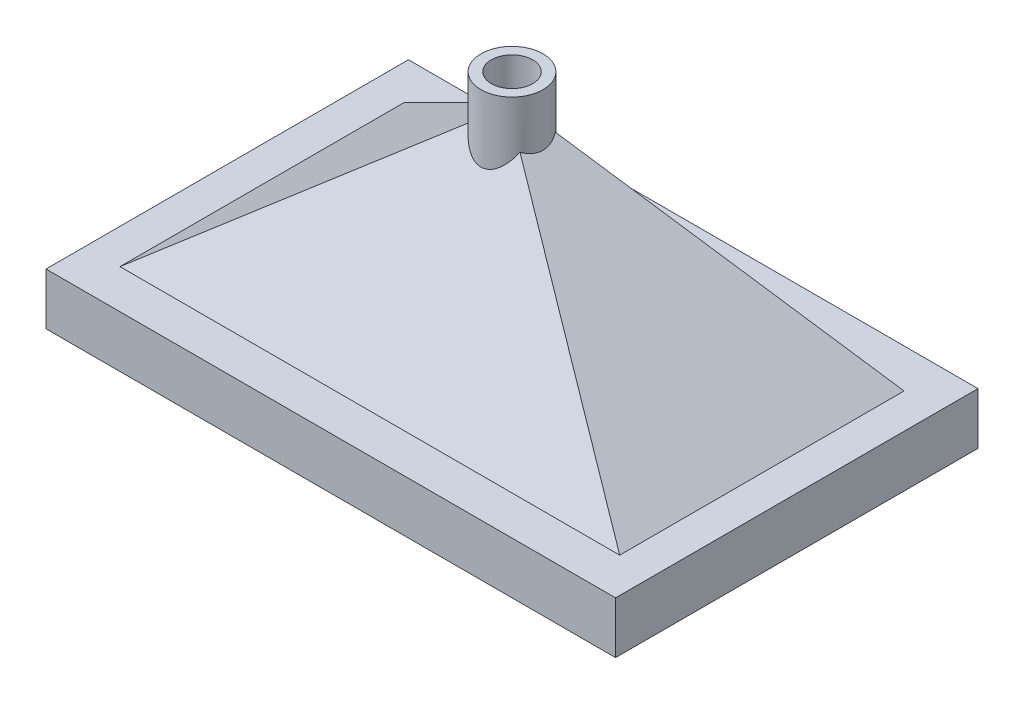
ISO-10303-21;
HEADER;
FILE_DESCRIPTION(('STEP AP214'),'2;1');
FILE_NAME('part.step','',(''),(''),'','','');
FILE_SCHEMA(('AUTOMOTIVE_DESIGN { 1 0 10303 214 1 1 1 1 }'));
ENDSEC;
DATA;
#1=APPLICATION_CONTEXT('core data for automotive mechanical design processes');
#2=APPLICATION_PROTOCOL_DEFINITION('international standard','automotive_design',2000,#1);
#3=PRODUCT_CONTEXT('',#1,'mechanical');
#4=PRODUCT('Part','Part','',(#3));
#5=PRODUCT_RELATED_PRODUCT_CATEGORY('part','',(#4));
#6=PRODUCT_DEFINITION_FORMATION('','',#4);
#7=PRODUCT_DEFINITION_CONTEXT('part definition',#1,'design');
#8=PRODUCT_DEFINITION('design','',#6,#7);
#9=PRODUCT_DEFINITION_SHAPE('','',#8);
#10=(LENGTH_UNIT() NAMED_UNIT(*) SI_UNIT(.MILLI.,.METRE.));
#11=(NAMED_UNIT(*) PLANE_ANGLE_UNIT() SI_UNIT($,.RADIAN.));
#12=(NAMED_UNIT(*) SI_UNIT($,.STERADIAN.) SOLID_ANGLE_UNIT());
#13=UNCERTAINTY_MEASURE_WITH_UNIT(LENGTH_MEASURE(1.E-05),#10,'distance_accuracy_value','');
#14=(GEOMETRIC_REPRESENTATION_CONTEXT(3) GLOBAL_UNCERTAINTY_ASSIGNED_CONTEXT((#13)) GLOBAL_UNIT_ASSIGNED_CONTEXT((#10,
#11,#12)) REPRESENTATION_CONTEXT('',''));
#15=CARTESIAN_POINT('',(0.,0.,0.));
#16=DIRECTION('',(0.,0.,1.));
#17=DIRECTION('',(1.,0.,0.));
#18=AXIS2_PLACEMENT_3D('',#15,#16,#17);
#19=CARTESIAN_POINT('',(-1.22788122702984,1.57870443475265,-25.));
#20=DIRECTION('',(-0.613940613514921,0.789352217376326,0.));
#21=DIRECTION('',(-0.789352217376326,-0.613940613514921,0.));
#22=AXIS2_PLACEMENT_3D('',#19,#20,#21);
#23=PLANE('',#22);
#24=CARTESIAN_POINT('',(0.,2.53372316688697,0.));
#25=DIRECTION('',(-0.613940613514921,0.789352217376326,0.));
#26=DIRECTION('',(0.789352217376326,0.613940613514921,0.));
#27=AXIS2_PLACEMENT_3D('',#24,#25,#26);
#28=ELLIPSE('',#27,7.60116950066092,6.);
#29=CARTESIAN_POINT('',(-4.94642029621275,-1.31349261905628,-3.39601623276666));
#30=VERTEX_POINT('',#29);
#31=CARTESIAN_POINT('',(-4.94642029621274,-1.31349261905627,3.39601623276666));
#32=VERTEX_POINT('',#31);
#33=EDGE_CURVE('E295',#30,#32,#28,.T.);
#34=ORIENTED_EDGE('',*,*,#33,.F.);
#35=DIRECTION('',(-0.722897396012249,-0.562253530231749,-0.40160966445125));
#36=VECTOR('',#35,1.);
#37=CARTESIAN_POINT('',(-8.09976991254644,-3.76609787620471,-5.14787713072983));
#38=LINE('',#37,#36);
#39=CARTESIAN_POINT('',(-48.2576440717118,-35.,-27.457807219155));
#40=VERTEX_POINT('',#39);
#41=EDGE_CURVE('E323',#30,#40,#38,.T.);
#42=ORIENTED_EDGE('',*,*,#41,.T.);
#43=DIRECTION('',(0.,0.,1.));
#44=VECTOR('',#43,1.);
#45=CARTESIAN_POINT('',(-48.2576440717118,-35.,0.));
#46=LINE('',#45,#44);
#47=CARTESIAN_POINT('',(-48.2576440717118,-35.,27.457807219155));
#48=VERTEX_POINT('',#47);
#49=EDGE_CURVE('E322',#40,#48,#46,.T.);
#50=ORIENTED_EDGE('',*,*,#49,.T.);
#51=DIRECTION('',(-0.722897396012249,-0.562253530231749,0.40160966445125));
#52=VECTOR('',#51,1.);
#53=CARTESIAN_POINT('',(6.41635911971163,7.52422470444046,-2.91663899830243));
#54=LINE('',#53,#52);
#55=EDGE_CURVE('E320',#32,#48,#54,.T.);
#56=ORIENTED_EDGE('',*,*,#55,.F.);
#57=EDGE_LOOP('',(#34,#42,#50,#56));
#58=FACE_BOUND('',#57,.T.);
#59=ADVANCED_FACE('F68',(#58),#23,.T.);
#60=CARTESIAN_POINT('',(1.22788122702984,1.57870443475265,-25.));
#61=DIRECTION('',(0.613940613514921,0.789352217376326,0.));
#62=DIRECTION('',(-0.789352217376326,0.613940613514921,0.));
#63=AXIS2_PLACEMENT_3D('',#60,#61,#62);
#64=PLANE('',#63);
#65=CARTESIAN_POINT('',(0.,2.53372316688697,0.));
#66=DIRECTION('',(0.613940613514921,0.789352217376326,0.));
#67=DIRECTION('',(-0.789352217376326,0.613940613514921,0.));
#68=AXIS2_PLACEMENT_3D('',#65,#66,#67);
#69=ELLIPSE('',#68,7.60116950066092,6.);
#70=CARTESIAN_POINT('',(4.94642029621274,-1.31349261905627,3.39601623276666));
#71=VERTEX_POINT('',#70);
#72=CARTESIAN_POINT('',(4.94642029621275,-1.31349261905628,-3.39601623276666));
#73=VERTEX_POINT('',#72);
#74=EDGE_CURVE('E84',#71,#73,#69,.T.);
#75=ORIENTED_EDGE('',*,*,#74,.F.);
#76=DIRECTION('',(-0.722897396012249,0.562253530231749,-0.40160966445125));
#77=VECTOR('',#76,1.);
#78=CARTESIAN_POINT('',(-6.41635911971163,7.52422470444046,-2.91663899830243));
#79=LINE('',#78,#77);
#80=CARTESIAN_POINT('',(48.2576440717118,-35.,27.457807219155));
#81=VERTEX_POINT('',#80);
#82=EDGE_CURVE('E327',#81,#71,#79,.T.);
#83=ORIENTED_EDGE('',*,*,#82,.F.);
#84=DIRECTION('',(0.,0.,-1.));
#85=VECTOR('',#84,1.);
#86=CARTESIAN_POINT('',(48.2576440717118,-35.,0.));
#87=LINE('',#86,#85);
#88=CARTESIAN_POINT('',(48.2576440717118,-35.,-27.4578072191551));
#89=VERTEX_POINT('',#88);
#90=EDGE_CURVE('E336',#81,#89,#87,.T.);
#91=ORIENTED_EDGE('',*,*,#90,.T.);
#92=DIRECTION('',(-0.722897396012249,0.562253530231749,0.40160966445125));
#93=VECTOR('',#92,1.);
#94=CARTESIAN_POINT('',(8.09976991254644,-3.76609787620471,-5.14787713072983));
#95=LINE('',#94,#93);
#96=EDGE_CURVE('E319',#89,#73,#95,.T.);
#97=ORIENTED_EDGE('',*,*,#96,.T.);
#98=EDGE_LOOP('',(#75,#83,#91,#97));
#99=FACE_BOUND('',#98,.T.);
#100=ADVANCED_FACE('F396',(#99),#64,.T.);
#101=CARTESIAN_POINT('',(-45.,1.16247638743819,1.62746694241347));
#102=DIRECTION('',(0.,-0.581238193719096,-0.813733471206735));
#103=DIRECTION('',(0.,0.813733471206735,-0.581238193719096));
#104=AXIS2_PLACEMENT_3D('',#101,#102,#103);
#105=PLANE('',#104);
#106=ORIENTED_EDGE('',*,*,#82,.T.);
#107=CARTESIAN_POINT('',(0.,3.44093010681705,0.));
#108=DIRECTION('',(0.,-0.581238193719096,-0.813733471206735));
#109=DIRECTION('',(0.,0.813733471206735,-0.581238193719096));
#110=AXIS2_PLACEMENT_3D('',#107,#108,#109);
#111=ELLIPSE('',#110,10.3227903204512,6.);
#112=EDGE_CURVE('E91',#71,#32,#111,.T.);
#113=ORIENTED_EDGE('',*,*,#112,.T.);
#114=ORIENTED_EDGE('',*,*,#55,.T.);
#115=DIRECTION('',(1.,0.,0.));
#116=VECTOR('',#115,1.);
#117=CARTESIAN_POINT('',(-45.,-35.,27.457807219155));
#118=LINE('',#117,#116);
#119=EDGE_CURVE('E333',#48,#81,#118,.T.);
#120=ORIENTED_EDGE('',*,*,#119,.T.);
#121=EDGE_LOOP('',(#106,#113,#114,#120));
#122=FACE_BOUND('',#121,.T.);
#123=ADVANCED_FACE('F402',(#122),#105,.F.);
#124=CARTESIAN_POINT('',(-45.,1.16247638743819,-1.62746694241347));
#125=DIRECTION('',(0.,0.581238193719096,-0.813733471206735));
#126=DIRECTION('',(0.,0.813733471206735,0.581238193719096));
#127=AXIS2_PLACEMENT_3D('',#124,#125,#126);
#128=PLANE('',#127);
#129=CARTESIAN_POINT('',(0.,3.44093010681705,0.));
#130=DIRECTION('',(0.,0.581238193719096,-0.813733471206735));
#131=DIRECTION('',(0.,0.813733471206735,0.581238193719096));
#132=AXIS2_PLACEMENT_3D('',#129,#130,#131);
#133=ELLIPSE('',#132,10.3227903204512,6.);
#134=EDGE_CURVE('E291',#73,#30,#133,.T.);
#135=ORIENTED_EDGE('',*,*,#134,.F.);
#136=ORIENTED_EDGE('',*,*,#96,.F.);
#137=DIRECTION('',(-1.,0.,0.));
#138=VECTOR('',#137,1.);
#139=CARTESIAN_POINT('',(0.,-35.,-27.457807219155));
#140=LINE('',#139,#138);
#141=EDGE_CURVE('E330',#89,#40,#140,.T.);
#142=ORIENTED_EDGE('',*,*,#141,.T.);
#143=ORIENTED_EDGE('',*,*,#41,.F.);
#144=EDGE_LOOP('',(#135,#136,#142,#143));
#145=FACE_BOUND('',#144,.T.);
#146=ADVANCED_FACE('F70',(#145),#128,.T.);
#147=CARTESIAN_POINT('',(0.,0.,-25.));
#148=DIRECTION('',(-0.613940613514921,0.789352217376326,0.));
#149=DIRECTION('',(-0.789352217376326,-0.613940613514921,0.));
#150=AXIS2_PLACEMENT_3D('',#147,#148,#149);
#151=PLANE('',#150);
#152=DIRECTION('',(-0.722897396012249,-0.562253530231749,-0.40160966445125));
#153=VECTOR('',#152,1.);
#154=CARTESIAN_POINT('',(-7.25806451612903,-5.64516129032258,-4.03225806451614));
#155=LINE('',#154,#153);
#156=CARTESIAN_POINT('',(-5.24494365672923,-4.07940062190051,-2.9138575870718));
#157=VERTEX_POINT('',#156);
#158=CARTESIAN_POINT('',(-45.,-35.,-25.));
#159=VERTEX_POINT('',#158);
#160=EDGE_CURVE('E302',#157,#159,#155,.T.);
#161=ORIENTED_EDGE('',*,*,#160,.F.);
#162=CARTESIAN_POINT('',(0.,0.,0.));
#163=DIRECTION('',(-0.613940613514921,0.789352217376326,0.));
#164=DIRECTION('',(0.789352217376326,0.613940613514921,0.));
#165=AXIS2_PLACEMENT_3D('',#162,#163,#164);
#166=ELLIPSE('',#165,7.60116950066092,6.);
#167=CARTESIAN_POINT('',(-5.24494365672923,-4.07940062190051,2.91385758707179));
#168=VERTEX_POINT('',#167);
#169=EDGE_CURVE('E283',#157,#168,#166,.T.);
#170=ORIENTED_EDGE('',*,*,#169,.T.);
#171=DIRECTION('',(-0.722897396012249,-0.562253530231749,0.40160966445125));
#172=VECTOR('',#171,1.);
#173=CARTESIAN_POINT('',(7.25806451612904,5.64516129032259,-4.03225806451613));
#174=LINE('',#173,#172);
#175=CARTESIAN_POINT('',(-45.,-35.,25.));
#176=VERTEX_POINT('',#175);
#177=EDGE_CURVE('E305',#168,#176,#174,.T.);
#178=ORIENTED_EDGE('',*,*,#177,.T.);
#179=DIRECTION('',(0.,0.,1.));
#180=VECTOR('',#179,1.);
#181=CARTESIAN_POINT('',(-45.,-35.,25.));
#182=LINE('',#181,#180);
#183=EDGE_CURVE('E307',#159,#176,#182,.T.);
#184=ORIENTED_EDGE('',*,*,#183,.F.);
#185=EDGE_LOOP('',(#161,#170,#178,#184));
#186=FACE_BOUND('',#185,.T.);
#187=ADVANCED_FACE('F369',(#186),#151,.F.);
#188=CARTESIAN_POINT('',(0.,0.,-25.));
#189=DIRECTION('',(0.613940613514921,0.789352217376326,0.));
#190=DIRECTION('',(-0.789352217376326,0.613940613514921,0.));
#191=AXIS2_PLACEMENT_3D('',#188,#189,#190);
#192=PLANE('',#191);
#193=DIRECTION('',(-0.722897396012249,0.562253530231749,-0.40160966445125));
#194=VECTOR('',#193,1.);
#195=CARTESIAN_POINT('',(-7.25806451612904,5.64516129032259,-4.03225806451613));
#196=LINE('',#195,#194);
#197=CARTESIAN_POINT('',(45.,-35.,25.));
#198=VERTEX_POINT('',#197);
#199=CARTESIAN_POINT('',(5.24494365672923,-4.07940062190051,2.91385758707179));
#200=VERTEX_POINT('',#199);
#201=EDGE_CURVE('E316',#198,#200,#196,.T.);
#202=ORIENTED_EDGE('',*,*,#201,.T.);
#203=CARTESIAN_POINT('',(0.,0.,0.));
#204=DIRECTION('',(0.613940613514921,0.789352217376326,0.));
#205=DIRECTION('',(-0.789352217376326,0.613940613514921,0.));
#206=AXIS2_PLACEMENT_3D('',#203,#204,#205);
#207=ELLIPSE('',#206,7.60116950066092,6.);
#208=CARTESIAN_POINT('',(5.24494365672923,-4.07940062190051,-2.9138575870718));
#209=VERTEX_POINT('',#208);
#210=EDGE_CURVE('E288',#200,#209,#207,.T.);
#211=ORIENTED_EDGE('',*,*,#210,.T.);
#212=DIRECTION('',(-0.722897396012249,0.562253530231749,0.40160966445125));
#213=VECTOR('',#212,1.);
#214=CARTESIAN_POINT('',(7.25806451612903,-5.64516129032258,-4.03225806451614));
#215=LINE('',#214,#213);
#216=CARTESIAN_POINT('',(45.,-35.,-25.));
#217=VERTEX_POINT('',#216);
#218=EDGE_CURVE('E299',#217,#209,#215,.T.);
#219=ORIENTED_EDGE('',*,*,#218,.F.);
#220=DIRECTION('',(0.,0.,-1.));
#221=VECTOR('',#220,1.);
#222=CARTESIAN_POINT('',(45.,-35.,25.));
#223=LINE('',#222,#221);
#224=EDGE_CURVE('E312',#198,#217,#223,.T.);
#225=ORIENTED_EDGE('',*,*,#224,.F.);
#226=EDGE_LOOP('',(#202,#211,#219,#225));
#227=FACE_BOUND('',#226,.T.);
#228=ADVANCED_FACE('F377',(#227),#192,.F.);
#229=CARTESIAN_POINT('',(-45.,0.,0.));
#230=DIRECTION('',(0.,-0.581238193719096,-0.813733471206735));
#231=DIRECTION('',(0.,0.813733471206735,-0.581238193719096));
#232=AXIS2_PLACEMENT_3D('',#229,#230,#231);
#233=PLANE('',#232);
#234=CARTESIAN_POINT('',(0.,0.,0.));
#235=DIRECTION('',(0.,-0.581238193719096,-0.813733471206735));
#236=DIRECTION('',(0.,0.813733471206735,-0.581238193719096));
#237=AXIS2_PLACEMENT_3D('',#234,#235,#236);
#238=ELLIPSE('',#237,6.88186021363411,4.);
#239=CARTESIAN_POINT('',(1.80136003041694,-5.,3.57142857142857));
#240=VERTEX_POINT('',#239);
#241=CARTESIAN_POINT('',(-1.80136003041694,-5.,3.57142857142857));
#242=VERTEX_POINT('',#241);
#243=EDGE_CURVE('E264',#240,#242,#238,.T.);
#244=ORIENTED_EDGE('',*,*,#243,.F.);
#245=DIRECTION('',(1.,0.,0.));
#246=VECTOR('',#245,1.);
#247=CARTESIAN_POINT('',(-45.,-5.,3.57142857142857));
#248=LINE('',#247,#246);
#249=CARTESIAN_POINT('',(4.82129629448178,-5.,3.57142857142857));
#250=VERTEX_POINT('',#249);
#251=EDGE_CURVE('E280',#240,#250,#248,.T.);
#252=ORIENTED_EDGE('',*,*,#251,.T.);
#253=CARTESIAN_POINT('',(0.,0.,0.));
#254=DIRECTION('',(0.,-0.581238193719096,-0.813733471206735));
#255=DIRECTION('',(0.,0.813733471206735,-0.581238193719096));
#256=AXIS2_PLACEMENT_3D('',#253,#254,#255);
#257=ELLIPSE('',#256,10.3227903204512,6.);
#258=EDGE_CURVE('E289',#200,#250,#257,.T.);
#259=ORIENTED_EDGE('',*,*,#258,.F.);
#260=ORIENTED_EDGE('',*,*,#201,.F.);
#261=DIRECTION('',(1.,0.,0.));
#262=VECTOR('',#261,1.);
#263=CARTESIAN_POINT('',(45.,-35.,25.));
#264=LINE('',#263,#262);
#265=EDGE_CURVE('E309',#176,#198,#264,.T.);
#266=ORIENTED_EDGE('',*,*,#265,.F.);
#267=ORIENTED_EDGE('',*,*,#177,.F.);
#268=CARTESIAN_POINT('',(-4.82129629448178,-5.,3.57142857142857));
#269=VERTEX_POINT('',#268);
#270=EDGE_CURVE('E285',#269,#168,#257,.T.);
#271=ORIENTED_EDGE('',*,*,#270,.F.);
#272=EDGE_CURVE('E282',#269,#242,#248,.T.);
#273=ORIENTED_EDGE('',*,*,#272,.T.);
#274=EDGE_LOOP('',(#244,#252,#259,#260,#266,#267,#271,#273));
#275=FACE_BOUND('',#274,.T.);
#276=ADVANCED_FACE('F361',(#275),#233,.T.);
#277=CARTESIAN_POINT('',(-45.,0.,0.));
#278=DIRECTION('',(0.,0.581238193719096,-0.813733471206735));
#279=DIRECTION('',(0.,0.813733471206735,0.581238193719096));
#280=AXIS2_PLACEMENT_3D('',#277,#278,#279);
#281=PLANE('',#280);
#282=DIRECTION('',(1.,0.,0.));
#283=VECTOR('',#282,1.);
#284=CARTESIAN_POINT('',(-45.,-5.,-3.57142857142857));
#285=LINE('',#284,#283);
#286=CARTESIAN_POINT('',(1.80136003041693,-5.,-3.57142857142857));
#287=VERTEX_POINT('',#286);
#288=CARTESIAN_POINT('',(4.82129629448178,-5.,-3.57142857142857));
#289=VERTEX_POINT('',#288);
#290=EDGE_CURVE('E329',#287,#289,#285,.T.);
#291=ORIENTED_EDGE('',*,*,#290,.F.);
#292=CARTESIAN_POINT('',(0.,0.,0.));
#293=DIRECTION('',(0.,0.581238193719096,-0.813733471206735));
#294=DIRECTION('',(0.,0.813733471206735,0.581238193719096));
#295=AXIS2_PLACEMENT_3D('',#292,#293,#294);
#296=ELLIPSE('',#295,6.88186021363411,4.);
#297=CARTESIAN_POINT('',(-1.80136003041694,-5.,-3.57142857142857));
#298=VERTEX_POINT('',#297);
#299=EDGE_CURVE('E262',#287,#298,#296,.T.);
#300=ORIENTED_EDGE('',*,*,#299,.T.);
#301=CARTESIAN_POINT('',(-4.82129629448178,-5.,-3.57142857142857));
#302=VERTEX_POINT('',#301);
#303=EDGE_CURVE('E77',#302,#298,#285,.T.);
#304=ORIENTED_EDGE('',*,*,#303,.F.);
#305=CARTESIAN_POINT('',(0.,0.,0.));
#306=DIRECTION('',(0.,0.581238193719096,-0.813733471206735));
#307=DIRECTION('',(0.,0.813733471206735,0.581238193719096));
#308=AXIS2_PLACEMENT_3D('',#305,#306,#307);
#309=ELLIPSE('',#308,10.3227903204512,6.);
#310=EDGE_CURVE('E12',#302,#157,#309,.T.);
#311=ORIENTED_EDGE('',*,*,#310,.T.);
#312=ORIENTED_EDGE('',*,*,#160,.T.);
#313=DIRECTION('',(-1.,0.,0.));
#314=VECTOR('',#313,1.);
#315=CARTESIAN_POINT('',(45.,-35.,-25.));
#316=LINE('',#315,#314);
#317=EDGE_CURVE('E215',#217,#159,#316,.T.);
#318=ORIENTED_EDGE('',*,*,#317,.F.);
#319=ORIENTED_EDGE('',*,*,#218,.T.);
#320=EDGE_CURVE('E72',#209,#289,#309,.T.);
#321=ORIENTED_EDGE('',*,*,#320,.T.);
#322=EDGE_LOOP('',(#291,#300,#304,#311,#312,#318,#319,#321));
#323=FACE_BOUND('',#322,.T.);
#324=ADVANCED_FACE('F367',(#323),#281,.F.);
#325=CARTESIAN_POINT('',(0.,-5.,0.));
#326=DIRECTION('',(0.,1.,0.));
#327=DIRECTION('',(0.,0.,1.));
#328=AXIS2_PLACEMENT_3D('',#325,#326,#327);
#329=PLANE('',#328);
#330=ORIENTED_EDGE('',*,*,#251,.F.);
#331=CARTESIAN_POINT('',(0.,-5.,0.));
#332=DIRECTION('',(0.,1.,0.));
#333=DIRECTION('',(0.,0.,1.));
#334=AXIS2_PLACEMENT_3D('',#331,#332,#333);
#335=CIRCLE('',#334,4.);
#336=EDGE_CURVE('E273',#240,#287,#335,.T.);
#337=ORIENTED_EDGE('',*,*,#336,.T.);
#338=ORIENTED_EDGE('',*,*,#290,.T.);
#339=CARTESIAN_POINT('',(0.,-5.,0.));
#340=DIRECTION('',(0.,1.,0.));
#341=DIRECTION('',(0.,0.,1.));
#342=AXIS2_PLACEMENT_3D('',#339,#340,#341);
#343=CIRCLE('',#342,6.);
#344=EDGE_CURVE('E277',#250,#289,#343,.T.);
#345=ORIENTED_EDGE('',*,*,#344,.F.);
#346=EDGE_LOOP('',(#330,#337,#338,#345));
#347=FACE_BOUND('',#346,.T.);
#348=ADVANCED_FACE('F383',(#347),#329,.F.);
#349=CARTESIAN_POINT('',(0.,-5.,0.));
#350=DIRECTION('',(0.,1.,0.));
#351=DIRECTION('',(0.,0.,1.));
#352=AXIS2_PLACEMENT_3D('',#349,#350,#351);
#353=CYLINDRICAL_SURFACE('',#352,6.);
#354=ORIENTED_EDGE('',*,*,#210,.F.);
#355=ORIENTED_EDGE('',*,*,#258,.T.);
#356=ORIENTED_EDGE('',*,*,#344,.T.);
#357=ORIENTED_EDGE('',*,*,#320,.F.);
#358=EDGE_LOOP('',(#354,#355,#356,#357));
#359=FACE_BOUND('',#358,.T.);
#360=ADVANCED_FACE('F381',(#359),#353,.T.);
#361=ORIENTED_EDGE('',*,*,#272,.F.);
#362=EDGE_CURVE('E276',#302,#269,#343,.T.);
#363=ORIENTED_EDGE('',*,*,#362,.F.);
#364=ORIENTED_EDGE('',*,*,#303,.T.);
#365=EDGE_CURVE('E272',#298,#242,#335,.T.);
#366=ORIENTED_EDGE('',*,*,#365,.T.);
#367=EDGE_LOOP('',(#361,#363,#364,#366));
#368=FACE_BOUND('',#367,.T.);
#369=ADVANCED_FACE('F350',(#368),#329,.F.);
#370=ORIENTED_EDGE('',*,*,#362,.T.);
#371=ORIENTED_EDGE('',*,*,#270,.T.);
#372=ORIENTED_EDGE('',*,*,#169,.F.);
#373=ORIENTED_EDGE('',*,*,#310,.F.);
#374=EDGE_LOOP('',(#370,#371,#372,#373));
#375=FACE_BOUND('',#374,.T.);
#376=ADVANCED_FACE('F364',(#375),#353,.T.);
#377=CARTESIAN_POINT('',(0.,8.00000000000001,0.));
#378=DIRECTION('',(0.,1.,0.));
#379=DIRECTION('',(0.,0.,1.));
#380=AXIS2_PLACEMENT_3D('',#377,#378,#379);
#381=CIRCLE('',#380,6.);
#382=CARTESIAN_POINT('',(0.,8.00000000000001,6.));
#383=VERTEX_POINT('',#382);
#384=EDGE_CURVE('E269',#383,#383,#381,.T.);
#385=ORIENTED_EDGE('',*,*,#384,.F.);
#386=EDGE_LOOP('',(#385));
#387=FACE_BOUND('',#386,.T.);
#388=ORIENTED_EDGE('',*,*,#112,.F.);
#389=ORIENTED_EDGE('',*,*,#74,.T.);
#390=ORIENTED_EDGE('',*,*,#134,.T.);
#391=ORIENTED_EDGE('',*,*,#33,.T.);
#392=EDGE_LOOP('',(#388,#389,#390,#391));
#393=FACE_BOUND('',#392,.T.);
#394=ADVANCED_FACE('F391',(#387,#393),#353,.T.);
#395=CARTESIAN_POINT('',(0.,-5.,0.));
#396=DIRECTION('',(0.,1.,0.));
#397=DIRECTION('',(0.,0.,1.));
#398=AXIS2_PLACEMENT_3D('',#395,#396,#397);
#399=CYLINDRICAL_SURFACE('',#398,4.);
#400=ORIENTED_EDGE('',*,*,#336,.F.);
#401=ORIENTED_EDGE('',*,*,#243,.T.);
#402=ORIENTED_EDGE('',*,*,#365,.F.);
#403=ORIENTED_EDGE('',*,*,#299,.F.);
#404=EDGE_LOOP('',(#400,#401,#402,#403));
#405=FACE_BOUND('',#404,.T.);
#406=CARTESIAN_POINT('',(0.,8.00000000000001,0.));
#407=DIRECTION('',(0.,1.,0.));
#408=DIRECTION('',(0.,0.,1.));
#409=AXIS2_PLACEMENT_3D('',#406,#407,#408);
#410=CIRCLE('',#409,4.);
#411=CARTESIAN_POINT('',(0.,8.00000000000001,4.));
#412=VERTEX_POINT('',#411);
#413=EDGE_CURVE('E266',#412,#412,#410,.T.);
#414=ORIENTED_EDGE('',*,*,#413,.T.);
#415=EDGE_LOOP('',(#414));
#416=FACE_BOUND('',#415,.T.);
#417=ADVANCED_FACE('F356',(#405,#416),#399,.F.);
#418=CARTESIAN_POINT('',(0.,8.00000000000001,0.));
#419=DIRECTION('',(0.,1.,0.));
#420=DIRECTION('',(0.,0.,1.));
#421=AXIS2_PLACEMENT_3D('',#418,#419,#420);
#422=PLANE('',#421);
#423=ORIENTED_EDGE('',*,*,#384,.T.);
#424=EDGE_LOOP('',(#423));
#425=FACE_BOUND('',#424,.T.);
#426=ORIENTED_EDGE('',*,*,#413,.F.);
#427=EDGE_LOOP('',(#426));
#428=FACE_BOUND('',#427,.T.);
#429=ADVANCED_FACE('F417',(#425,#428),#422,.T.);
#430=CARTESIAN_POINT('',(0.,-35.,0.));
#431=DIRECTION('',(0.,-1.,0.));
#432=DIRECTION('',(0.,0.,-1.));
#433=AXIS2_PLACEMENT_3D('',#430,#431,#432);
#434=PLANE('',#433);
#435=DIRECTION('',(0.,0.,-1.));
#436=VECTOR('',#435,1.);
#437=CARTESIAN_POINT('',(-55.,-35.,-35.));
#438=LINE('',#437,#436);
#439=CARTESIAN_POINT('',(-55.,-35.,35.));
#440=VERTEX_POINT('',#439);
#441=CARTESIAN_POINT('',(-55.,-35.,-35.));
#442=VERTEX_POINT('',#441);
#443=EDGE_CURVE('E216',#440,#442,#438,.T.);
#444=ORIENTED_EDGE('',*,*,#443,.F.);
#445=DIRECTION('',(-1.,0.,0.));
#446=VECTOR('',#445,1.);
#447=CARTESIAN_POINT('',(55.,-35.,35.));
#448=LINE('',#447,#446);
#449=CARTESIAN_POINT('',(55.,-35.,35.));
#450=VERTEX_POINT('',#449);
#451=EDGE_CURVE('E237',#450,#440,#448,.T.);
#452=ORIENTED_EDGE('',*,*,#451,.F.);
#453=DIRECTION('',(0.,0.,1.));
#454=VECTOR('',#453,1.);
#455=CARTESIAN_POINT('',(55.,-35.,-35.));
#456=LINE('',#455,#454);
#457=CARTESIAN_POINT('',(55.,-35.,-35.));
#458=VERTEX_POINT('',#457);
#459=EDGE_CURVE('E248',#458,#450,#456,.T.);
#460=ORIENTED_EDGE('',*,*,#459,.F.);
#461=DIRECTION('',(1.,0.,0.));
#462=VECTOR('',#461,1.);
#463=CARTESIAN_POINT('',(55.,-35.,-35.));
#464=LINE('',#463,#462);
#465=EDGE_CURVE('E246',#442,#458,#464,.T.);
#466=ORIENTED_EDGE('',*,*,#465,.F.);
#467=EDGE_LOOP('',(#444,#452,#460,#466));
#468=FACE_BOUND('',#467,.T.);
#469=ORIENTED_EDGE('',*,*,#90,.F.);
#470=ORIENTED_EDGE('',*,*,#119,.F.);
#471=ORIENTED_EDGE('',*,*,#49,.F.);
#472=ORIENTED_EDGE('',*,*,#141,.F.);
#473=EDGE_LOOP('',(#469,#470,#471,#472));
#474=FACE_BOUND('',#473,.T.);
#475=ADVANCED_FACE('F414',(#468,#474),#434,.F.);
#476=CARTESIAN_POINT('',(0.,-45.,0.));
#477=DIRECTION('',(0.,-1.,0.));
#478=DIRECTION('',(0.,0.,-1.));
#479=AXIS2_PLACEMENT_3D('',#476,#477,#478);
#480=PLANE('',#479);
#481=DIRECTION('',(0.,0.,-1.));
#482=VECTOR('',#481,1.);
#483=CARTESIAN_POINT('',(-55.,-45.,-35.));
#484=LINE('',#483,#482);
#485=CARTESIAN_POINT('',(-55.,-45.,35.));
#486=VERTEX_POINT('',#485);
#487=CARTESIAN_POINT('',(-55.,-45.,-35.));
#488=VERTEX_POINT('',#487);
#489=EDGE_CURVE('E233',#486,#488,#484,.T.);
#490=ORIENTED_EDGE('',*,*,#489,.T.);
#491=DIRECTION('',(1.,0.,0.));
#492=VECTOR('',#491,1.);
#493=CARTESIAN_POINT('',(55.,-45.,-35.));
#494=LINE('',#493,#492);
#495=CARTESIAN_POINT('',(55.,-45.,-35.));
#496=VERTEX_POINT('',#495);
#497=EDGE_CURVE('E236',#488,#496,#494,.T.);
#498=ORIENTED_EDGE('',*,*,#497,.T.);
#499=DIRECTION('',(0.,0.,1.));
#500=VECTOR('',#499,1.);
#501=CARTESIAN_POINT('',(55.,-45.,-35.));
#502=LINE('',#501,#500);
#503=CARTESIAN_POINT('',(55.,-45.,35.));
#504=VERTEX_POINT('',#503);
#505=EDGE_CURVE('E239',#496,#504,#502,.T.);
#506=ORIENTED_EDGE('',*,*,#505,.T.);
#507=DIRECTION('',(-1.,0.,0.));
#508=VECTOR('',#507,1.);
#509=CARTESIAN_POINT('',(55.,-45.,35.));
#510=LINE('',#509,#508);
#511=EDGE_CURVE('E241',#504,#486,#510,.T.);
#512=ORIENTED_EDGE('',*,*,#511,.T.);
#513=EDGE_LOOP('',(#490,#498,#506,#512));
#514=FACE_BOUND('',#513,.T.);
#515=DIRECTION('',(1.,0.,0.));
#516=VECTOR('',#515,1.);
#517=CARTESIAN_POINT('',(45.,-45.,-25.));
#518=LINE('',#517,#516);
#519=CARTESIAN_POINT('',(-45.,-45.,-25.));
#520=VERTEX_POINT('',#519);
#521=CARTESIAN_POINT('',(45.,-45.,-25.));
#522=VERTEX_POINT('',#521);
#523=EDGE_CURVE('E207',#520,#522,#518,.T.);
#524=ORIENTED_EDGE('',*,*,#523,.F.);
#525=DIRECTION('',(0.,0.,-1.));
#526=VECTOR('',#525,1.);
#527=CARTESIAN_POINT('',(-45.,-45.,-25.));
#528=LINE('',#527,#526);
#529=CARTESIAN_POINT('',(-45.,-45.,25.));
#530=VERTEX_POINT('',#529);
#531=EDGE_CURVE('E197',#530,#520,#528,.T.);
#532=ORIENTED_EDGE('',*,*,#531,.F.);
#533=DIRECTION('',(-1.,0.,0.));
#534=VECTOR('',#533,1.);
#535=CARTESIAN_POINT('',(45.,-45.,25.));
#536=LINE('',#535,#534);
#537=CARTESIAN_POINT('',(45.,-45.,25.));
#538=VERTEX_POINT('',#537);
#539=EDGE_CURVE('E224',#538,#530,#536,.T.);
#540=ORIENTED_EDGE('',*,*,#539,.F.);
#541=DIRECTION('',(0.,0.,1.));
#542=VECTOR('',#541,1.);
#543=CARTESIAN_POINT('',(45.,-45.,-25.));
#544=LINE('',#543,#542);
#545=EDGE_CURVE('E222',#522,#538,#544,.T.);
#546=ORIENTED_EDGE('',*,*,#545,.F.);
#547=EDGE_LOOP('',(#524,#532,#540,#546));
#548=FACE_BOUND('',#547,.T.);
#549=ADVANCED_FACE('F220',(#514,#548),#480,.T.);
#550=CARTESIAN_POINT('',(-55.,-45.,-35.));
#551=DIRECTION('',(1.,0.,0.));
#552=DIRECTION('',(0.,0.,-1.));
#553=AXIS2_PLACEMENT_3D('',#550,#551,#552);
#554=PLANE('',#553);
#555=ORIENTED_EDGE('',*,*,#443,.T.);
#556=DIRECTION('',(0.,1.,0.));
#557=VECTOR('',#556,1.);
#558=CARTESIAN_POINT('',(-55.,-45.,-35.));
#559=LINE('',#558,#557);
#560=EDGE_CURVE('E259',#488,#442,#559,.T.);
#561=ORIENTED_EDGE('',*,*,#560,.F.);
#562=ORIENTED_EDGE('',*,*,#489,.F.);
#563=DIRECTION('',(0.,1.,0.));
#564=VECTOR('',#563,1.);
#565=CARTESIAN_POINT('',(-55.,-45.,35.));
#566=LINE('',#565,#564);
#567=EDGE_CURVE('E243',#486,#440,#566,.T.);
#568=ORIENTED_EDGE('',*,*,#567,.T.);
#569=EDGE_LOOP('',(#555,#561,#562,#568));
#570=FACE_BOUND('',#569,.T.);
#571=ADVANCED_FACE('F424',(#570),#554,.F.);
#572=CARTESIAN_POINT('',(55.,-45.,-35.));
#573=DIRECTION('',(0.,0.,1.));
#574=DIRECTION('',(1.,0.,0.));
#575=AXIS2_PLACEMENT_3D('',#572,#573,#574);
#576=PLANE('',#575);
#577=ORIENTED_EDGE('',*,*,#465,.T.);
#578=DIRECTION('',(0.,1.,0.));
#579=VECTOR('',#578,1.);
#580=CARTESIAN_POINT('',(55.,-45.,-35.));
#581=LINE('',#580,#579);
#582=EDGE_CURVE('E256',#496,#458,#581,.T.);
#583=ORIENTED_EDGE('',*,*,#582,.F.);
#584=ORIENTED_EDGE('',*,*,#497,.F.);
#585=ORIENTED_EDGE('',*,*,#560,.T.);
#586=EDGE_LOOP('',(#577,#583,#584,#585));
#587=FACE_BOUND('',#586,.T.);
#588=ADVANCED_FACE('F439',(#587),#576,.F.);
#589=CARTESIAN_POINT('',(55.,-45.,-35.));
#590=DIRECTION('',(-1.,0.,0.));
#591=DIRECTION('',(0.,0.,1.));
#592=AXIS2_PLACEMENT_3D('',#589,#590,#591);
#593=PLANE('',#592);
#594=ORIENTED_EDGE('',*,*,#459,.T.);
#595=DIRECTION('',(0.,1.,0.));
#596=VECTOR('',#595,1.);
#597=CARTESIAN_POINT('',(55.,-45.,35.));
#598=LINE('',#597,#596);
#599=EDGE_CURVE('E253',#504,#450,#598,.T.);
#600=ORIENTED_EDGE('',*,*,#599,.F.);
#601=ORIENTED_EDGE('',*,*,#505,.F.);
#602=ORIENTED_EDGE('',*,*,#582,.T.);
#603=EDGE_LOOP('',(#594,#600,#601,#602));
#604=FACE_BOUND('',#603,.T.);
#605=ADVANCED_FACE('F435',(#604),#593,.F.);
#606=CARTESIAN_POINT('',(55.,-45.,35.));
#607=DIRECTION('',(0.,0.,-1.));
#608=DIRECTION('',(-1.,0.,0.));
#609=AXIS2_PLACEMENT_3D('',#606,#607,#608);
#610=PLANE('',#609);
#611=ORIENTED_EDGE('',*,*,#451,.T.);
#612=ORIENTED_EDGE('',*,*,#567,.F.);
#613=ORIENTED_EDGE('',*,*,#511,.F.);
#614=ORIENTED_EDGE('',*,*,#599,.T.);
#615=EDGE_LOOP('',(#611,#612,#613,#614));
#616=FACE_BOUND('',#615,.T.);
#617=ADVANCED_FACE('F432',(#616),#610,.F.);
#618=CARTESIAN_POINT('',(-45.,-45.,-25.));
#619=DIRECTION('',(1.,0.,0.));
#620=DIRECTION('',(0.,0.,-1.));
#621=AXIS2_PLACEMENT_3D('',#618,#619,#620);
#622=PLANE('',#621);
#623=ORIENTED_EDGE('',*,*,#183,.T.);
#624=DIRECTION('',(0.,1.,0.));
#625=VECTOR('',#624,1.);
#626=CARTESIAN_POINT('',(-45.,-45.,25.));
#627=LINE('',#626,#625);
#628=EDGE_CURVE('E203',#530,#176,#627,.T.);
#629=ORIENTED_EDGE('',*,*,#628,.F.);
#630=ORIENTED_EDGE('',*,*,#531,.T.);
#631=DIRECTION('',(0.,1.,0.));
#632=VECTOR('',#631,1.);
#633=CARTESIAN_POINT('',(-45.,-45.,-25.));
#634=LINE('',#633,#632);
#635=EDGE_CURVE('E201',#520,#159,#634,.T.);
#636=ORIENTED_EDGE('',*,*,#635,.T.);
#637=EDGE_LOOP('',(#623,#629,#630,#636));
#638=FACE_BOUND('',#637,.T.);
#639=ADVANCED_FACE('F200',(#638),#622,.T.);
#640=CARTESIAN_POINT('',(45.,-45.,-25.));
#641=DIRECTION('',(0.,0.,1.));
#642=DIRECTION('',(1.,0.,0.));
#643=AXIS2_PLACEMENT_3D('',#640,#641,#642);
#644=PLANE('',#643);
#645=ORIENTED_EDGE('',*,*,#317,.T.);
#646=ORIENTED_EDGE('',*,*,#635,.F.);
#647=ORIENTED_EDGE('',*,*,#523,.T.);
#648=DIRECTION('',(0.,1.,0.));
#649=VECTOR('',#648,1.);
#650=CARTESIAN_POINT('',(45.,-45.,-25.));
#651=LINE('',#650,#649);
#652=EDGE_CURVE('E217',#522,#217,#651,.T.);
#653=ORIENTED_EDGE('',*,*,#652,.T.);
#654=EDGE_LOOP('',(#645,#646,#647,#653));
#655=FACE_BOUND('',#654,.T.);
#656=ADVANCED_FACE('F211',(#655),#644,.T.);
#657=CARTESIAN_POINT('',(45.,-45.,-25.));
#658=DIRECTION('',(-1.,0.,0.));
#659=DIRECTION('',(0.,0.,1.));
#660=AXIS2_PLACEMENT_3D('',#657,#658,#659);
#661=PLANE('',#660);
#662=ORIENTED_EDGE('',*,*,#224,.T.);
#663=ORIENTED_EDGE('',*,*,#652,.F.);
#664=ORIENTED_EDGE('',*,*,#545,.T.);
#665=DIRECTION('',(0.,1.,0.));
#666=VECTOR('',#665,1.);
#667=CARTESIAN_POINT('',(45.,-45.,25.));
#668=LINE('',#667,#666);
#669=EDGE_CURVE('E229',#538,#198,#668,.T.);
#670=ORIENTED_EDGE('',*,*,#669,.T.);
#671=EDGE_LOOP('',(#662,#663,#664,#670));
#672=FACE_BOUND('',#671,.T.);
#673=ADVANCED_FACE('F374',(#672),#661,.T.);
#674=CARTESIAN_POINT('',(45.,-45.,25.));
#675=DIRECTION('',(0.,0.,-1.));
#676=DIRECTION('',(-1.,0.,0.));
#677=AXIS2_PLACEMENT_3D('',#674,#675,#676);
#678=PLANE('',#677);
#679=ORIENTED_EDGE('',*,*,#265,.T.);
#680=ORIENTED_EDGE('',*,*,#669,.F.);
#681=ORIENTED_EDGE('',*,*,#539,.T.);
#682=ORIENTED_EDGE('',*,*,#628,.T.);
#683=EDGE_LOOP('',(#679,#680,#681,#682));
#684=FACE_BOUND('',#683,.T.);
#685=ADVANCED_FACE('F372',(#684),#678,.T.);
#686=CLOSED_SHELL('',(#59,#100,#123,#146,#187,#228,#276,#324,#348,#360,#369,#376,#394,#417,#429,
#475,#549,#571,#588,#605,#617,#639,#656,#673,#685));
#687=MANIFOLD_SOLID_BREP('B2',#686);
#688=ADVANCED_BREP_SHAPE_REPRESENTATION('',(#18,#687),#14);
#689=SHAPE_DEFINITION_REPRESENTATION(#9,#688);
ENDSEC;
END-ISO-10303-21;
